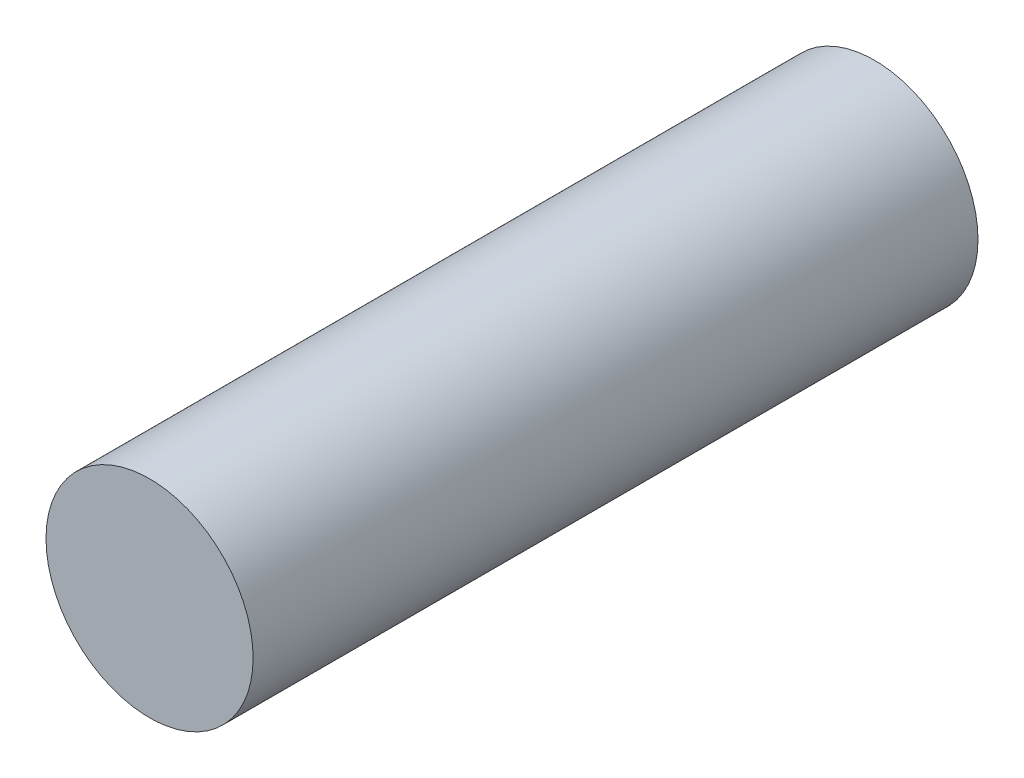
ISO-10303-21;
HEADER;
FILE_DESCRIPTION(('STEP AP214'),'2;1');
FILE_NAME('part.step','',(''),(''),'','','');
FILE_SCHEMA(('AUTOMOTIVE_DESIGN { 1 0 10303 214 1 1 1 1 }'));
ENDSEC;
DATA;
#1=APPLICATION_CONTEXT('core data for automotive mechanical design processes');
#2=APPLICATION_PROTOCOL_DEFINITION('international standard','automotive_design',2000,#1);
#3=PRODUCT_CONTEXT('',#1,'mechanical');
#4=PRODUCT('Part','Part','',(#3));
#5=PRODUCT_RELATED_PRODUCT_CATEGORY('part','',(#4));
#6=PRODUCT_DEFINITION_FORMATION('','',#4);
#7=PRODUCT_DEFINITION_CONTEXT('part definition',#1,'design');
#8=PRODUCT_DEFINITION('design','',#6,#7);
#9=PRODUCT_DEFINITION_SHAPE('','',#8);
#10=(LENGTH_UNIT() NAMED_UNIT(*) SI_UNIT(.MILLI.,.METRE.));
#11=(NAMED_UNIT(*) PLANE_ANGLE_UNIT() SI_UNIT($,.RADIAN.));
#12=(NAMED_UNIT(*) SI_UNIT($,.STERADIAN.) SOLID_ANGLE_UNIT());
#13=UNCERTAINTY_MEASURE_WITH_UNIT(LENGTH_MEASURE(1.E-05),#10,'distance_accuracy_value','');
#14=(GEOMETRIC_REPRESENTATION_CONTEXT(3) GLOBAL_UNCERTAINTY_ASSIGNED_CONTEXT((#13)) GLOBAL_UNIT_ASSIGNED_CONTEXT((#10,
#11,#12)) REPRESENTATION_CONTEXT('',''));
#15=CARTESIAN_POINT('',(0.,0.,0.));
#16=DIRECTION('',(0.,0.,1.));
#17=DIRECTION('',(1.,0.,0.));
#18=AXIS2_PLACEMENT_3D('',#15,#16,#17);
#19=CARTESIAN_POINT('',(0.,0.,7.));
#20=DIRECTION('',(0.,0.,-1.));
#21=DIRECTION('',(-1.,0.,0.));
#22=AXIS2_PLACEMENT_3D('',#19,#20,#21);
#23=CYLINDRICAL_SURFACE('',#22,1.);
#24=CARTESIAN_POINT('',(0.,0.,7.));
#25=DIRECTION('',(0.,0.,1.));
#26=DIRECTION('',(1.,0.,0.));
#27=AXIS2_PLACEMENT_3D('',#24,#25,#26);
#28=CIRCLE('',#27,1.);
#29=CARTESIAN_POINT('',(-1.,0.,7.));
#30=VERTEX_POINT('',#29);
#31=EDGE_CURVE('E10',#30,#30,#28,.T.);
#32=CARTESIAN_POINT('',(0.,0.,0.));
#33=DIRECTION('',(0.,0.,1.));
#34=DIRECTION('',(1.,0.,0.));
#35=AXIS2_PLACEMENT_3D('',#32,#33,#34);
#36=CIRCLE('',#35,1.);
#37=CARTESIAN_POINT('',(-1.,0.,0.));
#38=VERTEX_POINT('',#37);
#39=EDGE_CURVE('E34',#38,#38,#36,.T.);
#40=CARTESIAN_POINT('',(-1.,0.,7.));
#41=CARTESIAN_POINT('',(-1.,0.,6.92708333333333));
#42=CARTESIAN_POINT('',(-1.,0.,6.85416666666667));
#43=CARTESIAN_POINT('',(-1.,0.,6.70833333333333));
#44=CARTESIAN_POINT('',(-1.,0.,6.63541666666667));
#45=CARTESIAN_POINT('',(-1.,0.,6.48958333333333));
#46=CARTESIAN_POINT('',(-1.,0.,6.41666666666667));
#47=CARTESIAN_POINT('',(-1.,0.,6.27083333333333));
#48=CARTESIAN_POINT('',(-1.,0.,6.19791666666667));
#49=CARTESIAN_POINT('',(-1.,0.,6.05208333333333));
#50=CARTESIAN_POINT('',(-1.,0.,5.97916666666667));
#51=CARTESIAN_POINT('',(-1.,0.,5.83333333333333));
#52=CARTESIAN_POINT('',(-1.,0.,5.76041666666667));
#53=CARTESIAN_POINT('',(-1.,0.,5.61458333333333));
#54=CARTESIAN_POINT('',(-1.,0.,5.54166666666667));
#55=CARTESIAN_POINT('',(-1.,0.,5.39583333333333));
#56=CARTESIAN_POINT('',(-1.,0.,5.32291666666667));
#57=CARTESIAN_POINT('',(-1.,0.,5.17708333333333));
#58=CARTESIAN_POINT('',(-1.,0.,5.10416666666667));
#59=CARTESIAN_POINT('',(-1.,0.,4.95833333333333));
#60=CARTESIAN_POINT('',(-1.,0.,4.88541666666667));
#61=CARTESIAN_POINT('',(-1.,0.,4.73958333333333));
#62=CARTESIAN_POINT('',(-1.,0.,4.66666666666667));
#63=CARTESIAN_POINT('',(-1.,0.,4.52083333333333));
#64=CARTESIAN_POINT('',(-1.,0.,4.44791666666667));
#65=CARTESIAN_POINT('',(-1.,0.,4.30208333333333));
#66=CARTESIAN_POINT('',(-1.,0.,4.22916666666667));
#67=CARTESIAN_POINT('',(-1.,0.,4.08333333333333));
#68=CARTESIAN_POINT('',(-1.,0.,4.01041666666666));
#69=CARTESIAN_POINT('',(-1.,0.,3.86458333333333));
#70=CARTESIAN_POINT('',(-1.,0.,3.79166666666667));
#71=CARTESIAN_POINT('',(-1.,0.,3.64583333333333));
#72=CARTESIAN_POINT('',(-1.,0.,3.57291666666667));
#73=CARTESIAN_POINT('',(-1.,0.,3.42708333333333));
#74=CARTESIAN_POINT('',(-1.,0.,3.35416666666667));
#75=CARTESIAN_POINT('',(-1.,0.,3.20833333333333));
#76=CARTESIAN_POINT('',(-1.,0.,3.13541666666667));
#77=CARTESIAN_POINT('',(-1.,0.,2.98958333333333));
#78=CARTESIAN_POINT('',(-1.,0.,2.91666666666667));
#79=CARTESIAN_POINT('',(-1.,0.,2.77083333333333));
#80=CARTESIAN_POINT('',(-1.,0.,2.69791666666667));
#81=CARTESIAN_POINT('',(-1.,0.,2.55208333333333));
#82=CARTESIAN_POINT('',(-1.,0.,2.47916666666667));
#83=CARTESIAN_POINT('',(-1.,0.,2.33333333333333));
#84=CARTESIAN_POINT('',(-1.,0.,2.26041666666667));
#85=CARTESIAN_POINT('',(-1.,0.,2.11458333333333));
#86=CARTESIAN_POINT('',(-1.,0.,2.04166666666667));
#87=CARTESIAN_POINT('',(-1.,0.,1.89583333333333));
#88=CARTESIAN_POINT('',(-1.,0.,1.82291666666667));
#89=CARTESIAN_POINT('',(-1.,0.,1.67708333333333));
#90=CARTESIAN_POINT('',(-1.,0.,1.60416666666667));
#91=CARTESIAN_POINT('',(-1.,0.,1.45833333333333));
#92=CARTESIAN_POINT('',(-1.,0.,1.38541666666667));
#93=CARTESIAN_POINT('',(-1.,0.,1.23958333333333));
#94=CARTESIAN_POINT('',(-1.,0.,1.16666666666667));
#95=CARTESIAN_POINT('',(-1.,0.,1.02083333333333));
#96=CARTESIAN_POINT('',(-1.,0.,0.947916666666666));
#97=CARTESIAN_POINT('',(-1.,0.,0.802083333333332));
#98=CARTESIAN_POINT('',(-1.,0.,0.729166666666666));
#99=CARTESIAN_POINT('',(-1.,0.,0.583333333333332));
#100=CARTESIAN_POINT('',(-1.,0.,0.510416666666666));
#101=CARTESIAN_POINT('',(-1.,0.,0.364583333333333));
#102=CARTESIAN_POINT('',(-1.,0.,0.291666666666666));
#103=CARTESIAN_POINT('',(-1.,0.,0.145833333333333));
#104=CARTESIAN_POINT('',(-1.,0.,0.0729166666666657));
#105=CARTESIAN_POINT('',(-1.,0.,0.));
#106=B_SPLINE_CURVE_WITH_KNOTS('',3,(#40,#41,#42,#43,#44,#45,#46,#47,#48,#49,#50,#51,#52,#53,
#54,#55,#56,#57,#58,#59,#60,#61,#62,#63,#64,#65,#66,#67,#68,#69,#70,#71,#72,#73,#74,#75,#76,#77,
#78,#79,#80,#81,#82,#83,#84,#85,#86,#87,#88,#89,#90,#91,#92,#93,#94,#95,#96,#97,#98,#99,#100,
#101,#102,#103,#104,#105),.UNSPECIFIED.,.F.,.F.,(4,2,2,2,2,2,2,2,2,2,2,2,2,2,2,2,2,2,2,2,2,2,2,
2,2,2,2,2,2,2,2,2,4),(0.,0.21875,0.4375,0.656250000000001,0.875000000000001,1.09375,1.3125,
1.53125,1.75,1.96875,2.1875,2.40625,2.625,2.84375,3.0625,3.28125,3.5,3.71875,3.9375,4.15625,
4.375,4.59375,4.8125,5.03125,5.25,5.46875,5.6875,5.90625,6.125,6.34375,6.5625,6.78125,7.),.UNSPECIFIED.);
#107=EDGE_CURVE('BSEAM31',#30,#38,#106,.T.);
#108=ORIENTED_EDGE('',*,*,#31,.F.);
#109=ORIENTED_EDGE('',*,*,#39,.T.);
#110=ORIENTED_EDGE('',*,*,#107,.T.);
#111=ORIENTED_EDGE('',*,*,#107,.F.);
#112=EDGE_LOOP('',(#108,#110,#109,#111));
#113=FACE_BOUND('',#112,.T.);
#114=ADVANCED_FACE('F31',(#113),#23,.T.);
#115=CARTESIAN_POINT('',(0.,0.,7.));
#116=DIRECTION('',(0.,0.,1.));
#117=DIRECTION('',(1.,0.,0.));
#118=AXIS2_PLACEMENT_3D('',#115,#116,#117);
#119=PLANE('',#118);
#120=ORIENTED_EDGE('',*,*,#31,.T.);
#121=EDGE_LOOP('',(#120));
#122=FACE_BOUND('',#121,.T.);
#123=ADVANCED_FACE('F46',(#122),#119,.T.);
#124=CARTESIAN_POINT('',(0.,0.,0.));
#125=DIRECTION('',(0.,0.,1.));
#126=DIRECTION('',(1.,0.,0.));
#127=AXIS2_PLACEMENT_3D('',#124,#125,#126);
#128=PLANE('',#127);
#129=ORIENTED_EDGE('',*,*,#39,.F.);
#130=EDGE_LOOP('',(#129));
#131=FACE_BOUND('',#130,.T.);
#132=ADVANCED_FACE('F44',(#131),#128,.F.);
#133=CLOSED_SHELL('',(#114,#123,#132));
#134=MANIFOLD_SOLID_BREP('B2',#133);
#135=ADVANCED_BREP_SHAPE_REPRESENTATION('',(#18,#134),#14);
#136=SHAPE_DEFINITION_REPRESENTATION(#9,#135);
ENDSEC;
END-ISO-10303-21;
